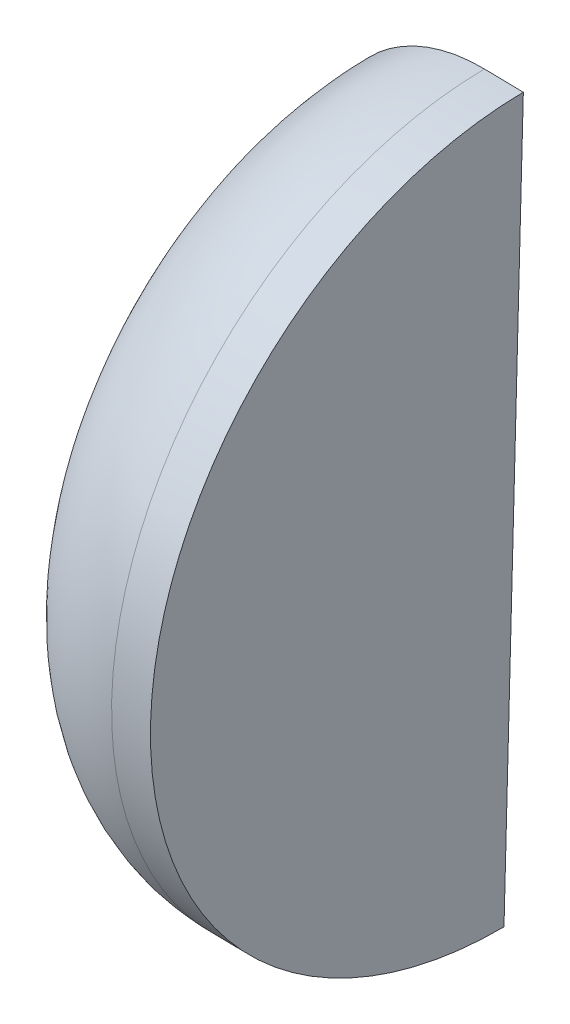
ISO-10303-21;
HEADER;
FILE_DESCRIPTION(('STEP AP214'),'2;1');
FILE_NAME('part.step','',(''),(''),'','','');
FILE_SCHEMA(('AUTOMOTIVE_DESIGN { 1 0 10303 214 1 1 1 1 }'));
ENDSEC;
DATA;
#1=APPLICATION_CONTEXT('core data for automotive mechanical design processes');
#2=APPLICATION_PROTOCOL_DEFINITION('international standard','automotive_design',2000,#1);
#3=PRODUCT_CONTEXT('',#1,'mechanical');
#4=PRODUCT('Part','Part','',(#3));
#5=PRODUCT_RELATED_PRODUCT_CATEGORY('part','',(#4));
#6=PRODUCT_DEFINITION_FORMATION('','',#4);
#7=PRODUCT_DEFINITION_CONTEXT('part definition',#1,'design');
#8=PRODUCT_DEFINITION('design','',#6,#7);
#9=PRODUCT_DEFINITION_SHAPE('','',#8);
#10=(LENGTH_UNIT() NAMED_UNIT(*) SI_UNIT(.MILLI.,.METRE.));
#11=(NAMED_UNIT(*) PLANE_ANGLE_UNIT() SI_UNIT($,.RADIAN.));
#12=(NAMED_UNIT(*) SI_UNIT($,.STERADIAN.) SOLID_ANGLE_UNIT());
#13=UNCERTAINTY_MEASURE_WITH_UNIT(LENGTH_MEASURE(1.E-05),#10,'distance_accuracy_value','');
#14=(GEOMETRIC_REPRESENTATION_CONTEXT(3) GLOBAL_UNCERTAINTY_ASSIGNED_CONTEXT((#13)) GLOBAL_UNIT_ASSIGNED_CONTEXT((#10,
#11,#12)) REPRESENTATION_CONTEXT('',''));
#15=CARTESIAN_POINT('',(0.,0.,0.));
#16=DIRECTION('',(0.,0.,1.));
#17=DIRECTION('',(1.,0.,0.));
#18=AXIS2_PLACEMENT_3D('',#15,#16,#17);
#19=CARTESIAN_POINT('',(-110.335843814774,4.70053709314471,2.59939724972955));
#20=DIRECTION('',(0.999619261087744,-0.0261769483078608,-0.00872354513260905));
#21=DIRECTION('',(-0.00872653549837458,0.,-0.999961923064172));
#22=AXIS2_PLACEMENT_3D('',#19,#20,#21);
#23=CYLINDRICAL_SURFACE('',#22,54.625);
#24=CARTESIAN_POINT('',(-87.344600809756,4.09846728206391,2.39875571167954));
#25=DIRECTION('',(-0.999619261087744,0.0261769483078608,0.00872354513260905));
#26=DIRECTION('',(0.00872653549837458,0.,0.999961923064172));
#27=AXIS2_PLACEMENT_3D('',#24,#25,#26);
#28=CIRCLE('',#27,54.625);
#29=CARTESIAN_POINT('',(-85.9147394552513,58.7047486588538,2.38627750067899));
#30=VERTEX_POINT('',#29);
#31=CARTESIAN_POINT('',(-88.7744621642606,-50.5078140947259,2.4112339226801));
#32=VERTEX_POINT('',#31);
#33=EDGE_CURVE('E44',#30,#32,#28,.F.);
#34=ORIENTED_EDGE('',*,*,#33,.T.);
#35=DIRECTION('',(0.999619261087744,-0.0261769483078608,-0.00872354513260905));
#36=VECTOR('',#35,1.);
#37=CARTESIAN_POINT('',(-111.765705169279,-49.9057442836451,2.61187546073011));
#38=LINE('',#37,#36);
#39=CARTESIAN_POINT('',(-83.0266514130061,-50.6583315474961,2.3610735381676));
#40=VERTEX_POINT('',#39);
#41=EDGE_CURVE('E89',#32,#40,#38,.T.);
#42=ORIENTED_EDGE('',*,*,#41,.T.);
#43=CARTESIAN_POINT('',(-81.5967900585014,3.94794982929371,2.34859532716704));
#44=DIRECTION('',(-0.999619261087744,0.0261769483078608,0.00872354513260905));
#45=DIRECTION('',(0.00872653549837458,0.,0.999961923064172));
#46=AXIS2_PLACEMENT_3D('',#43,#44,#45);
#47=CIRCLE('',#46,54.625);
#48=CARTESIAN_POINT('',(-80.1669287039967,58.5542312060835,2.33611711616649));
#49=VERTEX_POINT('',#48);
#50=EDGE_CURVE('E108',#40,#49,#47,.T.);
#51=ORIENTED_EDGE('',*,*,#50,.T.);
#52=DIRECTION('',(0.999619261087744,-0.0261769483078608,-0.00872354513260905));
#53=VECTOR('',#52,1.);
#54=CARTESIAN_POINT('',(-108.905982460269,59.3068184699346,2.586919038729));
#55=LINE('',#54,#53);
#56=EDGE_CURVE('E119',#49,#30,#55,.F.);
#57=ORIENTED_EDGE('',*,*,#56,.T.);
#58=EDGE_LOOP('',(#34,#42,#51,#57));
#59=FACE_BOUND('',#58,.T.);
#60=ADVANCED_FACE('F36',(#59),#23,.T.);
#61=CARTESIAN_POINT('',(-81.5967900585014,3.94794982929371,2.34859532716704));
#62=DIRECTION('',(-0.999619261087744,0.0261769483078608,0.00872354513260905));
#63=DIRECTION('',(0.00872653549837458,0.,0.999961923064172));
#64=AXIS2_PLACEMENT_3D('',#61,#62,#63);
#65=PLANE('',#64);
#66=ORIENTED_EDGE('',*,*,#50,.F.);
#67=DIRECTION('',(0.0261759515698798,0.999657324975558,-0.000228434068660072));
#68=VECTOR('',#67,1.);
#69=CARTESIAN_POINT('',(-81.5967900585014,3.94794982929371,2.34859532716704));
#70=LINE('',#69,#68);
#71=EDGE_CURVE('E121',#40,#49,#70,.T.);
#72=ORIENTED_EDGE('',*,*,#71,.T.);
#73=EDGE_LOOP('',(#66,#72));
#74=FACE_BOUND('',#73,.T.);
#75=ADVANCED_FACE('F154',(#74),#65,.F.);
#76=CARTESIAN_POINT('',(-87.344600809756,4.09846728206391,2.39875571167954));
#77=DIRECTION('',(-0.999619261087744,0.0261769483078608,0.00872354513260905));
#78=DIRECTION('',(0.00872653549837458,0.,0.999961923064172));
#79=AXIS2_PLACEMENT_3D('',#76,#77,#78);
#80=TOROIDAL_SURFACE('',#79,31.625,23.);
#81=CARTESIAN_POINT('',(-86.5167863413585,35.7126301844159,2.39153148425817));
#82=DIRECTION('',(0.00872653549837458,0.,0.999961923064172));
#83=DIRECTION('',(0.999619261087744,-0.0261769483078608,-0.00872354513260905));
#84=AXIS2_PLACEMENT_3D('',#81,#82,#83);
#85=CIRCLE('',#84,23.);
#86=CARTESIAN_POINT('',(-109.508029346377,36.3146999954967,2.59217302230818));
#87=VERTEX_POINT('',#86);
#88=EDGE_CURVE('E105',#87,#30,#85,.F.);
#89=ORIENTED_EDGE('',*,*,#88,.F.);
#90=CARTESIAN_POINT('',(-110.335843814774,4.70053709314471,2.59939724972955));
#91=DIRECTION('',(-0.999619261087744,0.0261769483078608,0.00872354513260905));
#92=DIRECTION('',(0.00872653549837458,0.,0.999961923064172));
#93=AXIS2_PLACEMENT_3D('',#90,#91,#92);
#94=CIRCLE('',#93,31.625);
#95=CARTESIAN_POINT('',(-111.163658283172,-26.9136258092073,2.60662147715093));
#96=VERTEX_POINT('',#95);
#97=EDGE_CURVE('E100',#96,#87,#94,.T.);
#98=ORIENTED_EDGE('',*,*,#97,.F.);
#99=CARTESIAN_POINT('',(-88.1724152781534,-27.5156956202881,2.40597993910092));
#100=DIRECTION('',(0.00872653549837458,0.,0.999961923064172));
#101=DIRECTION('',(0.999619261087744,-0.0261769483078608,-0.00872354513260905));
#102=AXIS2_PLACEMENT_3D('',#99,#100,#101);
#103=CIRCLE('',#102,23.);
#104=EDGE_CURVE('E84',#32,#96,#103,.F.);
#105=ORIENTED_EDGE('',*,*,#104,.F.);
#106=ORIENTED_EDGE('',*,*,#33,.F.);
#107=EDGE_LOOP('',(#89,#98,#105,#106));
#108=FACE_BOUND('',#107,.T.);
#109=ADVANCED_FACE('F38',(#108),#80,.T.);
#110=CARTESIAN_POINT('',(-101.714127687892,4.47476091398941,2.5241566729608));
#111=DIRECTION('',(-0.999619261087744,0.0261769483078608,0.00872354513260905));
#112=DIRECTION('',(0.00872653549837458,0.,0.999961923064172));
#113=AXIS2_PLACEMENT_3D('',#110,#111,#112);
#114=CYLINDRICAL_SURFACE('',#113,31.625);
#115=ORIENTED_EDGE('',*,*,#97,.T.);
#116=DIRECTION('',(-0.999619261087744,0.0261769483078608,0.00872354513260905));
#117=VECTOR('',#116,1.);
#118=CARTESIAN_POINT('',(-100.886313219495,36.0889238163414,2.51693244553942));
#119=LINE('',#118,#117);
#120=CARTESIAN_POINT('',(-100.886313219495,36.0889238163414,2.51693244553942));
#121=VERTEX_POINT('',#120);
#122=EDGE_CURVE('E124',#87,#121,#119,.F.);
#123=ORIENTED_EDGE('',*,*,#122,.T.);
#124=CARTESIAN_POINT('',(-101.714127687892,4.47476091398941,2.5241566729608));
#125=DIRECTION('',(-0.999619261087744,0.0261769483078608,0.00872354513260905));
#126=DIRECTION('',(0.00872653549837458,0.,0.999961923064172));
#127=AXIS2_PLACEMENT_3D('',#124,#125,#126);
#128=CIRCLE('',#127,31.625);
#129=CARTESIAN_POINT('',(-102.54194215629,-27.1394019883626,2.53138090038217));
#130=VERTEX_POINT('',#129);
#131=EDGE_CURVE('E102',#130,#121,#128,.T.);
#132=ORIENTED_EDGE('',*,*,#131,.F.);
#133=DIRECTION('',(-0.999619261087744,0.0261769483078608,0.00872354513260905));
#134=VECTOR('',#133,1.);
#135=CARTESIAN_POINT('',(-102.54194215629,-27.1394019883626,2.53138090038217));
#136=LINE('',#135,#134);
#137=EDGE_CURVE('E87',#130,#96,#136,.T.);
#138=ORIENTED_EDGE('',*,*,#137,.T.);
#139=EDGE_LOOP('',(#115,#123,#132,#138));
#140=FACE_BOUND('',#139,.T.);
#141=ADVANCED_FACE('F98',(#140),#114,.F.);
#142=CARTESIAN_POINT('',(-101.714127687892,4.47476091398941,2.5241566729608));
#143=DIRECTION('',(-0.999619261087744,0.0261769483078608,0.00872354513260905));
#144=DIRECTION('',(0.00872653549837458,0.,0.999961923064172));
#145=AXIS2_PLACEMENT_3D('',#142,#143,#144);
#146=PLANE('',#145);
#147=DIRECTION('',(0.0261759515698798,0.999657324975558,-0.000228434068660072));
#148=VECTOR('',#147,1.);
#149=CARTESIAN_POINT('',(-101.714127687892,4.47476091398941,2.5241566729608));
#150=LINE('',#149,#148);
#151=CARTESIAN_POINT('',(-102.015151130946,-7.0212983232295,2.52678366475039));
#152=VERTEX_POINT('',#151);
#153=EDGE_CURVE('E55',#130,#152,#150,.T.);
#154=ORIENTED_EDGE('',*,*,#153,.F.);
#155=ORIENTED_EDGE('',*,*,#131,.T.);
#156=CARTESIAN_POINT('',(-101.413104244839,15.9708201512083,2.52152968117121));
#157=VERTEX_POINT('',#156);
#158=EDGE_CURVE('E139',#157,#121,#150,.T.);
#159=ORIENTED_EDGE('',*,*,#158,.F.);
#160=CARTESIAN_POINT('',(-101.714127687892,4.47476091398941,2.5241566729608));
#161=DIRECTION('',(-0.999619261087744,0.0261769483078608,0.00872354513260905));
#162=DIRECTION('',(0.00872653549837458,0.,0.999961923064172));
#163=AXIS2_PLACEMENT_3D('',#160,#161,#162);
#164=CIRCLE('',#163,11.5);
#165=EDGE_CURVE('E111',#152,#157,#164,.T.);
#166=ORIENTED_EDGE('',*,*,#165,.F.);
#167=EDGE_LOOP('',(#154,#155,#159,#166));
#168=FACE_BOUND('',#167,.T.);
#169=ADVANCED_FACE('F138',(#168),#146,.T.);
#170=CARTESIAN_POINT('',(-110.335843814774,4.70053709314471,2.59939724972955));
#171=DIRECTION('',(0.999619261087744,-0.0261769483078608,-0.00872354513260905));
#172=DIRECTION('',(-0.00872653549837458,0.,-0.999961923064172));
#173=AXIS2_PLACEMENT_3D('',#170,#171,#172);
#174=CYLINDRICAL_SURFACE('',#173,11.5);
#175=CARTESIAN_POINT('',(-110.335843814774,4.70053709314471,2.59939724972955));
#176=DIRECTION('',(-0.999619261087744,0.0261769483078608,0.00872354513260905));
#177=DIRECTION('',(0.00872653549837458,0.,0.999961923064172));
#178=AXIS2_PLACEMENT_3D('',#175,#176,#177);
#179=CIRCLE('',#178,11.5);
#180=CARTESIAN_POINT('',(-110.636867257828,-6.79552214407421,2.60202424151914));
#181=VERTEX_POINT('',#180);
#182=CARTESIAN_POINT('',(-110.03482037172,16.1965963303636,2.59677025793996));
#183=VERTEX_POINT('',#182);
#184=EDGE_CURVE('E106',#181,#183,#179,.T.);
#185=ORIENTED_EDGE('',*,*,#184,.F.);
#186=DIRECTION('',(0.999619261087744,-0.0261769483078608,-0.00872354513260905));
#187=VECTOR('',#186,1.);
#188=CARTESIAN_POINT('',(-110.636867257828,-6.79552214407421,2.60202424151914));
#189=LINE('',#188,#187);
#190=EDGE_CURVE('E50',#181,#152,#189,.T.);
#191=ORIENTED_EDGE('',*,*,#190,.T.);
#192=ORIENTED_EDGE('',*,*,#165,.T.);
#193=DIRECTION('',(0.999619261087744,-0.0261769483078608,-0.00872354513260905));
#194=VECTOR('',#193,1.);
#195=CARTESIAN_POINT('',(-110.03482037172,16.1965963303636,2.59677025793996));
#196=LINE('',#195,#194);
#197=EDGE_CURVE('E135',#157,#183,#196,.F.);
#198=ORIENTED_EDGE('',*,*,#197,.T.);
#199=EDGE_LOOP('',(#185,#191,#192,#198));
#200=FACE_BOUND('',#199,.T.);
#201=ADVANCED_FACE('F134',(#200),#174,.T.);
#202=CARTESIAN_POINT('',(-110.335843814774,4.70053709314471,2.59939724972955));
#203=DIRECTION('',(-0.999619261087744,0.0261769483078608,0.00872354513260905));
#204=DIRECTION('',(0.00872653549837458,0.,0.999961923064172));
#205=AXIS2_PLACEMENT_3D('',#202,#203,#204);
#206=PLANE('',#205);
#207=DIRECTION('',(0.0261759515698798,0.999657324975558,-0.000228434068660072));
#208=VECTOR('',#207,1.);
#209=CARTESIAN_POINT('',(-110.335843814774,4.70053709314471,2.59939724972955));
#210=LINE('',#209,#208);
#211=EDGE_CURVE('E11',#181,#183,#210,.T.);
#212=ORIENTED_EDGE('',*,*,#211,.F.);
#213=ORIENTED_EDGE('',*,*,#184,.T.);
#214=EDGE_LOOP('',(#212,#213));
#215=FACE_BOUND('',#214,.T.);
#216=ADVANCED_FACE('F143',(#215),#206,.T.);
#217=CARTESIAN_POINT('',(-51.3208491643447,61.8889493466175,2.08438119374217));
#218=DIRECTION('',(0.00872653549837458,0.,0.999961923064172));
#219=DIRECTION('',(0.999619261087744,-0.0261769483078608,-0.00872354513260905));
#220=AXIS2_PLACEMENT_3D('',#217,#218,#219);
#221=PLANE('',#220);
#222=ORIENTED_EDGE('',*,*,#211,.T.);
#223=ORIENTED_EDGE('',*,*,#197,.F.);
#224=ORIENTED_EDGE('',*,*,#158,.T.);
#225=ORIENTED_EDGE('',*,*,#122,.F.);
#226=ORIENTED_EDGE('',*,*,#88,.T.);
#227=ORIENTED_EDGE('',*,*,#56,.F.);
#228=ORIENTED_EDGE('',*,*,#71,.F.);
#229=ORIENTED_EDGE('',*,*,#41,.F.);
#230=ORIENTED_EDGE('',*,*,#104,.T.);
#231=ORIENTED_EDGE('',*,*,#137,.F.);
#232=ORIENTED_EDGE('',*,*,#153,.T.);
#233=ORIENTED_EDGE('',*,*,#190,.F.);
#234=EDGE_LOOP('',(#222,#223,#224,#225,#226,#227,#228,#229,#230,#231,#232,#233));
#235=FACE_BOUND('',#234,.T.);
#236=ADVANCED_FACE('F86',(#235),#221,.F.);
#237=CLOSED_SHELL('',(#60,#75,#109,#141,#169,#201,#216,#236));
#238=MANIFOLD_SOLID_BREP('B2',#237);
#239=ADVANCED_BREP_SHAPE_REPRESENTATION('',(#18,#238),#14);
#240=SHAPE_DEFINITION_REPRESENTATION(#9,#239);
ENDSEC;
END-ISO-10303-21;
